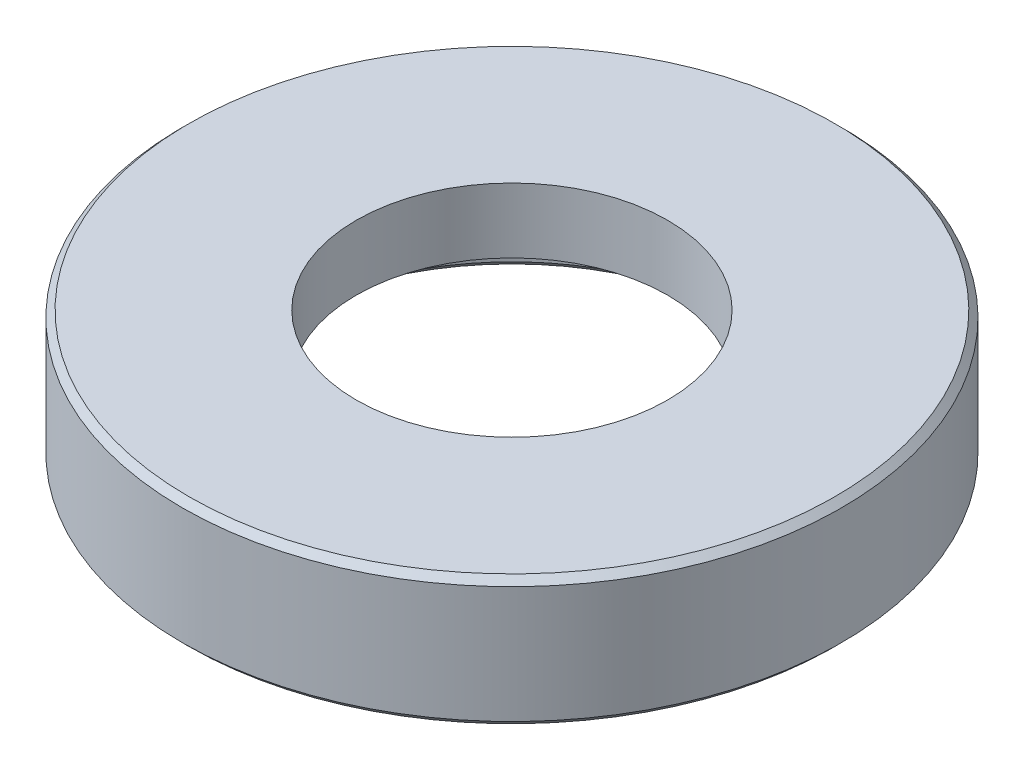
ISO-10303-21;
HEADER;
FILE_DESCRIPTION(('STEP AP214'),'2;1');
FILE_NAME('part.step','',(''),(''),'','','');
FILE_SCHEMA(('AUTOMOTIVE_DESIGN { 1 0 10303 214 1 1 1 1 }'));
ENDSEC;
DATA;
#1=APPLICATION_CONTEXT('core data for automotive mechanical design processes');
#2=APPLICATION_PROTOCOL_DEFINITION('international standard','automotive_design',2000,#1);
#3=PRODUCT_CONTEXT('',#1,'mechanical');
#4=PRODUCT('Part','Part','',(#3));
#5=PRODUCT_RELATED_PRODUCT_CATEGORY('part','',(#4));
#6=PRODUCT_DEFINITION_FORMATION('','',#4);
#7=PRODUCT_DEFINITION_CONTEXT('part definition',#1,'design');
#8=PRODUCT_DEFINITION('design','',#6,#7);
#9=PRODUCT_DEFINITION_SHAPE('','',#8);
#10=(LENGTH_UNIT() NAMED_UNIT(*) SI_UNIT(.MILLI.,.METRE.));
#11=(NAMED_UNIT(*) PLANE_ANGLE_UNIT() SI_UNIT($,.RADIAN.));
#12=(NAMED_UNIT(*) SI_UNIT($,.STERADIAN.) SOLID_ANGLE_UNIT());
#13=UNCERTAINTY_MEASURE_WITH_UNIT(LENGTH_MEASURE(1.E-05),#10,'distance_accuracy_value','');
#14=(GEOMETRIC_REPRESENTATION_CONTEXT(3) GLOBAL_UNCERTAINTY_ASSIGNED_CONTEXT((#13)) GLOBAL_UNIT_ASSIGNED_CONTEXT((#10,
#11,#12)) REPRESENTATION_CONTEXT('',''));
#15=CARTESIAN_POINT('',(0.,0.,0.));
#16=DIRECTION('',(0.,0.,1.));
#17=DIRECTION('',(1.,0.,0.));
#18=AXIS2_PLACEMENT_3D('',#15,#16,#17);
#19=CARTESIAN_POINT('',(0.,5.,0.));
#20=DIRECTION('',(0.,-1.,0.));
#21=DIRECTION('',(0.,0.,-1.));
#22=AXIS2_PLACEMENT_3D('',#19,#20,#21);
#23=CYLINDRICAL_SURFACE('',#22,12.7);
#24=CARTESIAN_POINT('',(0.,4.75,0.));
#25=DIRECTION('',(0.,1.,0.));
#26=DIRECTION('',(0.,0.,1.));
#27=AXIS2_PLACEMENT_3D('',#24,#25,#26);
#28=CIRCLE('',#27,12.7);
#29=CARTESIAN_POINT('',(0.,4.75,12.7));
#30=VERTEX_POINT('',#29);
#31=EDGE_CURVE('E45',#30,#30,#28,.F.);
#32=ORIENTED_EDGE('',*,*,#31,.T.);
#33=EDGE_LOOP('',(#32));
#34=FACE_BOUND('',#33,.T.);
#35=CARTESIAN_POINT('',(0.,0.250000000000002,0.));
#36=DIRECTION('',(0.,1.,0.));
#37=DIRECTION('',(0.,0.,1.));
#38=AXIS2_PLACEMENT_3D('',#35,#36,#37);
#39=CIRCLE('',#38,12.7);
#40=CARTESIAN_POINT('',(0.,0.250000000000002,12.7));
#41=VERTEX_POINT('',#40);
#42=EDGE_CURVE('E50',#41,#41,#39,.T.);
#43=ORIENTED_EDGE('',*,*,#42,.T.);
#44=EDGE_LOOP('',(#43));
#45=FACE_BOUND('',#44,.T.);
#46=ADVANCED_FACE('F30',(#34,#45),#23,.T.);
#47=CARTESIAN_POINT('',(0.,5.,0.));
#48=DIRECTION('',(0.,1.,0.));
#49=DIRECTION('',(0.,0.,1.));
#50=AXIS2_PLACEMENT_3D('',#47,#48,#49);
#51=PLANE('',#50);
#52=CARTESIAN_POINT('',(0.,5.,0.));
#53=DIRECTION('',(0.,1.,0.));
#54=DIRECTION('',(0.,0.,1.));
#55=AXIS2_PLACEMENT_3D('',#52,#53,#54);
#56=CIRCLE('',#55,12.45);
#57=CARTESIAN_POINT('',(0.,5.,12.45));
#58=VERTEX_POINT('',#57);
#59=EDGE_CURVE('E53',#58,#58,#56,.T.);
#60=ORIENTED_EDGE('',*,*,#59,.T.);
#61=EDGE_LOOP('',(#60));
#62=FACE_BOUND('',#61,.T.);
#63=CARTESIAN_POINT('',(0.,5.,0.));
#64=DIRECTION('',(0.,1.,0.));
#65=DIRECTION('',(0.,0.,1.));
#66=AXIS2_PLACEMENT_3D('',#63,#64,#65);
#67=CIRCLE('',#66,6.);
#68=CARTESIAN_POINT('',(0.,5.,6.));
#69=VERTEX_POINT('',#68);
#70=EDGE_CURVE('E56',#69,#69,#67,.T.);
#71=ORIENTED_EDGE('',*,*,#70,.F.);
#72=EDGE_LOOP('',(#71));
#73=FACE_BOUND('',#72,.T.);
#74=ADVANCED_FACE('F77',(#62,#73),#51,.T.);
#75=CARTESIAN_POINT('',(0.,0.,0.));
#76=DIRECTION('',(0.,1.,0.));
#77=DIRECTION('',(0.,0.,1.));
#78=AXIS2_PLACEMENT_3D('',#75,#76,#77);
#79=PLANE('',#78);
#80=CARTESIAN_POINT('',(0.,0.,0.));
#81=DIRECTION('',(0.,1.,0.));
#82=DIRECTION('',(0.,0.,1.));
#83=AXIS2_PLACEMENT_3D('',#80,#81,#82);
#84=CIRCLE('',#83,9.25);
#85=CARTESIAN_POINT('',(0.,0.,9.25));
#86=VERTEX_POINT('',#85);
#87=EDGE_CURVE('E37',#86,#86,#84,.T.);
#88=ORIENTED_EDGE('',*,*,#87,.T.);
#89=EDGE_LOOP('',(#88));
#90=FACE_BOUND('',#89,.T.);
#91=CARTESIAN_POINT('',(0.,0.,0.));
#92=DIRECTION('',(0.,1.,0.));
#93=DIRECTION('',(0.,0.,1.));
#94=AXIS2_PLACEMENT_3D('',#91,#92,#93);
#95=CIRCLE('',#94,12.45);
#96=CARTESIAN_POINT('',(0.,0.,12.45));
#97=VERTEX_POINT('',#96);
#98=EDGE_CURVE('E41',#97,#97,#95,.F.);
#99=ORIENTED_EDGE('',*,*,#98,.T.);
#100=EDGE_LOOP('',(#99));
#101=FACE_BOUND('',#100,.T.);
#102=ADVANCED_FACE('F73',(#90,#101),#79,.F.);
#103=CARTESIAN_POINT('',(0.,21.9705627484771,0.));
#104=DIRECTION('',(0.,-1.,0.));
#105=DIRECTION('',(0.,0.,-1.));
#106=AXIS2_PLACEMENT_3D('',#103,#104,#105);
#107=CYLINDRICAL_SURFACE('',#106,6.);
#108=CARTESIAN_POINT('',(0.,2.5,0.));
#109=DIRECTION('',(0.,1.,0.));
#110=DIRECTION('',(0.,0.,1.));
#111=AXIS2_PLACEMENT_3D('',#108,#109,#110);
#112=CIRCLE('',#111,6.);
#113=CARTESIAN_POINT('',(0.,2.5,6.));
#114=VERTEX_POINT('',#113);
#115=EDGE_CURVE('E62',#114,#114,#112,.T.);
#116=ORIENTED_EDGE('',*,*,#115,.F.);
#117=EDGE_LOOP('',(#116));
#118=FACE_BOUND('',#117,.T.);
#119=ORIENTED_EDGE('',*,*,#70,.T.);
#120=EDGE_LOOP('',(#119));
#121=FACE_BOUND('',#120,.T.);
#122=ADVANCED_FACE('F69',(#118,#121),#107,.F.);
#123=CARTESIAN_POINT('',(0.,2.5,0.));
#124=DIRECTION('',(0.,-1.,0.));
#125=DIRECTION('',(0.,0.,-1.));
#126=AXIS2_PLACEMENT_3D('',#123,#124,#125);
#127=CYLINDRICAL_SURFACE('',#126,9.);
#128=CARTESIAN_POINT('',(0.,0.250000000000002,0.));
#129=DIRECTION('',(0.,1.,0.));
#130=DIRECTION('',(0.,0.,1.));
#131=AXIS2_PLACEMENT_3D('',#128,#129,#130);
#132=CIRCLE('',#131,9.);
#133=CARTESIAN_POINT('',(0.,0.250000000000002,9.));
#134=VERTEX_POINT('',#133);
#135=EDGE_CURVE('E10',#134,#134,#132,.F.);
#136=ORIENTED_EDGE('',*,*,#135,.T.);
#137=EDGE_LOOP('',(#136));
#138=FACE_BOUND('',#137,.T.);
#139=CARTESIAN_POINT('',(0.,2.5,0.));
#140=DIRECTION('',(0.,1.,0.));
#141=DIRECTION('',(0.,0.,1.));
#142=AXIS2_PLACEMENT_3D('',#139,#140,#141);
#143=CIRCLE('',#142,9.);
#144=CARTESIAN_POINT('',(0.,2.5,9.));
#145=VERTEX_POINT('',#144);
#146=EDGE_CURVE('E59',#145,#145,#143,.T.);
#147=ORIENTED_EDGE('',*,*,#146,.T.);
#148=EDGE_LOOP('',(#147));
#149=FACE_BOUND('',#148,.T.);
#150=ADVANCED_FACE('F72',(#138,#149),#127,.F.);
#151=CARTESIAN_POINT('',(0.,2.5,0.));
#152=DIRECTION('',(0.,1.,0.));
#153=DIRECTION('',(0.,0.,1.));
#154=AXIS2_PLACEMENT_3D('',#151,#152,#153);
#155=PLANE('',#154);
#156=ORIENTED_EDGE('',*,*,#115,.T.);
#157=EDGE_LOOP('',(#156));
#158=FACE_BOUND('',#157,.T.);
#159=ORIENTED_EDGE('',*,*,#146,.F.);
#160=EDGE_LOOP('',(#159));
#161=FACE_BOUND('',#160,.T.);
#162=ADVANCED_FACE('F66',(#158,#161),#155,.F.);
#163=CARTESIAN_POINT('',(0.,5.,0.));
#164=DIRECTION('',(0.,-1.,0.));
#165=DIRECTION('',(0.,0.,-1.));
#166=AXIS2_PLACEMENT_3D('',#163,#164,#165);
#167=CONICAL_SURFACE('',#166,12.45,0.785398163397455);
#168=ORIENTED_EDGE('',*,*,#31,.F.);
#169=EDGE_LOOP('',(#168));
#170=FACE_BOUND('',#169,.T.);
#171=ORIENTED_EDGE('',*,*,#59,.F.);
#172=EDGE_LOOP('',(#171));
#173=FACE_BOUND('',#172,.T.);
#174=ADVANCED_FACE('F90',(#170,#173),#167,.T.);
#175=CARTESIAN_POINT('',(0.,0.,0.));
#176=DIRECTION('',(0.,-1.,0.));
#177=DIRECTION('',(0.,0.,-1.));
#178=AXIS2_PLACEMENT_3D('',#175,#176,#177);
#179=CONICAL_SURFACE('',#178,9.25,0.785398163397448);
#180=ORIENTED_EDGE('',*,*,#135,.F.);
#181=EDGE_LOOP('',(#180));
#182=FACE_BOUND('',#181,.T.);
#183=ORIENTED_EDGE('',*,*,#87,.F.);
#184=EDGE_LOOP('',(#183));
#185=FACE_BOUND('',#184,.T.);
#186=ADVANCED_FACE('F92',(#182,#185),#179,.F.);
#187=CARTESIAN_POINT('',(0.,0.250000000000002,0.));
#188=DIRECTION('',(0.,1.,0.));
#189=DIRECTION('',(0.,0.,1.));
#190=AXIS2_PLACEMENT_3D('',#187,#188,#189);
#191=CONICAL_SURFACE('',#190,12.7,0.785398163397445);
#192=ORIENTED_EDGE('',*,*,#98,.F.);
#193=EDGE_LOOP('',(#192));
#194=FACE_BOUND('',#193,.T.);
#195=ORIENTED_EDGE('',*,*,#42,.F.);
#196=EDGE_LOOP('',(#195));
#197=FACE_BOUND('',#196,.T.);
#198=ADVANCED_FACE('F32',(#194,#197),#191,.T.);
#199=CLOSED_SHELL('',(#46,#74,#102,#122,#150,#162,#174,#186,#198));
#200=MANIFOLD_SOLID_BREP('B2',#199);
#201=ADVANCED_BREP_SHAPE_REPRESENTATION('',(#18,#200),#14);
#202=SHAPE_DEFINITION_REPRESENTATION(#9,#201);
ENDSEC;
END-ISO-10303-21;
